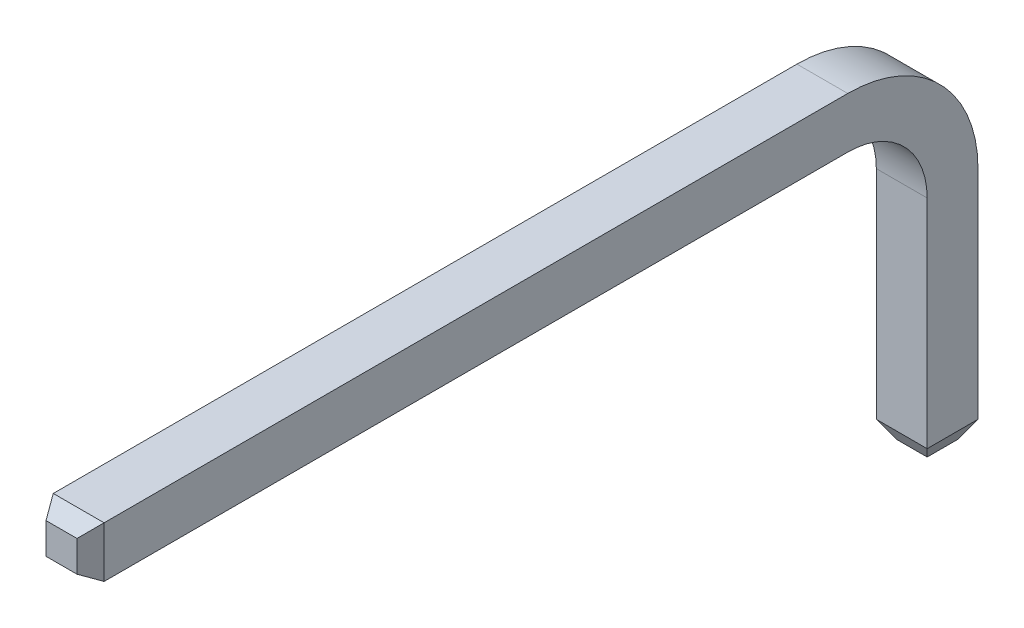
ISO-10303-21;
HEADER;
FILE_DESCRIPTION(('STEP AP214'),'2;1');
FILE_NAME('part.step','',(''),(''),'','','');
FILE_SCHEMA(('AUTOMOTIVE_DESIGN { 1 0 10303 214 1 1 1 1 }'));
ENDSEC;
DATA;
#1=APPLICATION_CONTEXT('core data for automotive mechanical design processes');
#2=APPLICATION_PROTOCOL_DEFINITION('international standard','automotive_design',2000,#1);
#3=PRODUCT_CONTEXT('',#1,'mechanical');
#4=PRODUCT('Part','Part','',(#3));
#5=PRODUCT_RELATED_PRODUCT_CATEGORY('part','',(#4));
#6=PRODUCT_DEFINITION_FORMATION('','',#4);
#7=PRODUCT_DEFINITION_CONTEXT('part definition',#1,'design');
#8=PRODUCT_DEFINITION('design','',#6,#7);
#9=PRODUCT_DEFINITION_SHAPE('','',#8);
#10=(LENGTH_UNIT() NAMED_UNIT(*) SI_UNIT(.MILLI.,.METRE.));
#11=(NAMED_UNIT(*) PLANE_ANGLE_UNIT() SI_UNIT($,.RADIAN.));
#12=(NAMED_UNIT(*) SI_UNIT($,.STERADIAN.) SOLID_ANGLE_UNIT());
#13=UNCERTAINTY_MEASURE_WITH_UNIT(LENGTH_MEASURE(1.E-05),#10,'distance_accuracy_value','');
#14=(GEOMETRIC_REPRESENTATION_CONTEXT(3) GLOBAL_UNCERTAINTY_ASSIGNED_CONTEXT((#13)) GLOBAL_UNIT_ASSIGNED_CONTEXT((#10,
#11,#12)) REPRESENTATION_CONTEXT('',''));
#15=CARTESIAN_POINT('',(0.,0.,0.));
#16=DIRECTION('',(0.,0.,1.));
#17=DIRECTION('',(1.,0.,0.));
#18=AXIS2_PLACEMENT_3D('',#15,#16,#17);
#19=CARTESIAN_POINT('',(0.195,-4.27,-1.78));
#20=DIRECTION('',(-0.866025403784329,0.50000000000019,0.));
#21=DIRECTION('',(-0.50000000000019,-0.866025403784329,0.));
#22=AXIS2_PLACEMENT_3D('',#19,#20,#21);
#23=PLANE('',#22);
#24=DIRECTION('',(0.,0.,-1.));
#25=VECTOR('',#24,1.);
#26=CARTESIAN_POINT('',(0.32,-4.053493649054,9.44));
#27=LINE('',#26,#25);
#28=CARTESIAN_POINT('',(0.32,-4.053493649054,-1.14));
#29=VERTEX_POINT('',#28);
#30=CARTESIAN_POINT('',(0.32,-4.053493649054,-1.78));
#31=VERTEX_POINT('',#30);
#32=EDGE_CURVE('E109',#29,#31,#27,.T.);
#33=ORIENTED_EDGE('',*,*,#32,.F.);
#34=DIRECTION('',(-0.447213595500096,-0.774596669241325,-0.447213595500094));
#35=VECTOR('',#34,1.);
#36=CARTESIAN_POINT('',(0.32,-4.053493649054,-1.14));
#37=LINE('',#36,#35);
#38=CARTESIAN_POINT('',(0.195,-4.27,-1.265));
#39=VERTEX_POINT('',#38);
#40=EDGE_CURVE('E191',#29,#39,#37,.T.);
#41=ORIENTED_EDGE('',*,*,#40,.T.);
#42=DIRECTION('',(0.,0.,-1.));
#43=VECTOR('',#42,1.);
#44=CARTESIAN_POINT('',(0.195,-4.27,-1.46));
#45=LINE('',#44,#43);
#46=CARTESIAN_POINT('',(0.195,-4.27,-1.655));
#47=VERTEX_POINT('',#46);
#48=EDGE_CURVE('E208',#47,#39,#45,.F.);
#49=ORIENTED_EDGE('',*,*,#48,.F.);
#50=DIRECTION('',(0.447213595500096,0.774596669241325,-0.447213595500094));
#51=VECTOR('',#50,1.);
#52=CARTESIAN_POINT('',(0.195,-4.27,-1.655));
#53=LINE('',#52,#51);
#54=EDGE_CURVE('E200',#47,#31,#53,.T.);
#55=ORIENTED_EDGE('',*,*,#54,.T.);
#56=EDGE_LOOP('',(#33,#41,#49,#55));
#57=FACE_BOUND('',#56,.T.);
#58=ADVANCED_FACE('F16',(#57),#23,.F.);
#59=CARTESIAN_POINT('',(0.195,0.32,9.44));
#60=DIRECTION('',(0.866025403784329,0.,0.50000000000019));
#61=DIRECTION('',(0.50000000000019,0.,-0.866025403784329));
#62=AXIS2_PLACEMENT_3D('',#59,#60,#61);
#63=PLANE('',#62);
#64=DIRECTION('',(0.447213595500092,0.447213595500094,-0.774596669241328));
#65=VECTOR('',#64,1.);
#66=CARTESIAN_POINT('',(0.195,0.195,9.44));
#67=LINE('',#66,#65);
#68=CARTESIAN_POINT('',(0.195,0.195,9.44));
#69=VERTEX_POINT('',#68);
#70=CARTESIAN_POINT('',(0.32,0.32,9.223493649054));
#71=VERTEX_POINT('',#70);
#72=EDGE_CURVE('E169',#69,#71,#67,.T.);
#73=ORIENTED_EDGE('',*,*,#72,.F.);
#74=DIRECTION('',(0.,1.,0.));
#75=VECTOR('',#74,1.);
#76=CARTESIAN_POINT('',(0.195,0.,9.44));
#77=LINE('',#76,#75);
#78=CARTESIAN_POINT('',(0.195,-0.195,9.44));
#79=VERTEX_POINT('',#78);
#80=EDGE_CURVE('E165',#69,#79,#77,.F.);
#81=ORIENTED_EDGE('',*,*,#80,.T.);
#82=DIRECTION('',(-0.447213595500092,0.447213595500094,0.774596669241328));
#83=VECTOR('',#82,1.);
#84=CARTESIAN_POINT('',(0.32,-0.320000000000001,9.223493649054));
#85=LINE('',#84,#83);
#86=CARTESIAN_POINT('',(0.32,-0.32,9.223493649054));
#87=VERTEX_POINT('',#86);
#88=EDGE_CURVE('E160',#87,#79,#85,.T.);
#89=ORIENTED_EDGE('',*,*,#88,.F.);
#90=DIRECTION('',(0.,1.,0.));
#91=VECTOR('',#90,1.);
#92=CARTESIAN_POINT('',(0.32,0.32,9.223493649054));
#93=LINE('',#92,#91);
#94=EDGE_CURVE('E178',#71,#87,#93,.F.);
#95=ORIENTED_EDGE('',*,*,#94,.F.);
#96=EDGE_LOOP('',(#73,#81,#89,#95));
#97=FACE_BOUND('',#96,.T.);
#98=ADVANCED_FACE('F308',(#97),#63,.T.);
#99=CARTESIAN_POINT('',(0.,-4.27,-1.46));
#100=DIRECTION('',(0.,-1.,0.));
#101=DIRECTION('',(0.,0.,-1.));
#102=AXIS2_PLACEMENT_3D('',#99,#100,#101);
#103=PLANE('',#102);
#104=ORIENTED_EDGE('',*,*,#48,.T.);
#105=DIRECTION('',(1.,0.,0.));
#106=VECTOR('',#105,1.);
#107=CARTESIAN_POINT('',(0.32,-4.27,-1.265));
#108=LINE('',#107,#106);
#109=CARTESIAN_POINT('',(-0.195,-4.27,-1.265));
#110=VERTEX_POINT('',#109);
#111=EDGE_CURVE('E196',#39,#110,#108,.F.);
#112=ORIENTED_EDGE('',*,*,#111,.T.);
#113=DIRECTION('',(0.,0.,1.));
#114=VECTOR('',#113,1.);
#115=CARTESIAN_POINT('',(-0.195,-4.27,-1.14));
#116=LINE('',#115,#114);
#117=CARTESIAN_POINT('',(-0.195,-4.27,-1.655));
#118=VERTEX_POINT('',#117);
#119=EDGE_CURVE('E128',#110,#118,#116,.F.);
#120=ORIENTED_EDGE('',*,*,#119,.T.);
#121=DIRECTION('',(1.,0.,0.));
#122=VECTOR('',#121,1.);
#123=CARTESIAN_POINT('',(-0.32,-4.27,-1.655));
#124=LINE('',#123,#122);
#125=EDGE_CURVE('E205',#118,#47,#124,.T.);
#126=ORIENTED_EDGE('',*,*,#125,.T.);
#127=EDGE_LOOP('',(#104,#112,#120,#126));
#128=FACE_BOUND('',#127,.T.);
#129=ADVANCED_FACE('F306',(#128),#103,.T.);
#130=CARTESIAN_POINT('',(-0.32,-4.27,-1.655));
#131=DIRECTION('',(0.,0.50000000000019,0.866025403784329));
#132=DIRECTION('',(0.,-0.866025403784329,0.50000000000019));
#133=AXIS2_PLACEMENT_3D('',#130,#131,#132);
#134=PLANE('',#133);
#135=DIRECTION('',(-1.,0.,0.));
#136=VECTOR('',#135,1.);
#137=CARTESIAN_POINT('',(-0.32,-4.053493649054,-1.78));
#138=LINE('',#137,#136);
#139=CARTESIAN_POINT('',(-0.32,-4.053493649054,-1.78));
#140=VERTEX_POINT('',#139);
#141=EDGE_CURVE('E114',#31,#140,#138,.T.);
#142=ORIENTED_EDGE('',*,*,#141,.F.);
#143=ORIENTED_EDGE('',*,*,#54,.F.);
#144=ORIENTED_EDGE('',*,*,#125,.F.);
#145=DIRECTION('',(-0.447213595500093,0.774596669241325,-0.447213595500096));
#146=VECTOR('',#145,1.);
#147=CARTESIAN_POINT('',(-0.195,-4.27,-1.655));
#148=LINE('',#147,#146);
#149=EDGE_CURVE('E130',#118,#140,#148,.T.);
#150=ORIENTED_EDGE('',*,*,#149,.T.);
#151=EDGE_LOOP('',(#142,#143,#144,#150));
#152=FACE_BOUND('',#151,.T.);
#153=ADVANCED_FACE('F264',(#152),#134,.F.);
#154=CARTESIAN_POINT('',(0.32,-4.27,-1.265));
#155=DIRECTION('',(0.,0.50000000000019,-0.866025403784329));
#156=DIRECTION('',(0.,0.866025403784329,0.50000000000019));
#157=AXIS2_PLACEMENT_3D('',#154,#155,#156);
#158=PLANE('',#157);
#159=DIRECTION('',(1.,0.,0.));
#160=VECTOR('',#159,1.);
#161=CARTESIAN_POINT('',(0.32,-4.053493649054,-1.14));
#162=LINE('',#161,#160);
#163=CARTESIAN_POINT('',(-0.32,-4.053493649054,-1.14));
#164=VERTEX_POINT('',#163);
#165=EDGE_CURVE('E187',#164,#29,#162,.T.);
#166=ORIENTED_EDGE('',*,*,#165,.F.);
#167=DIRECTION('',(0.447213595500094,-0.774596669241326,-0.447213595500096));
#168=VECTOR('',#167,1.);
#169=CARTESIAN_POINT('',(-0.319999999999999,-4.053493649054,-1.14));
#170=LINE('',#169,#168);
#171=EDGE_CURVE('E250',#164,#110,#170,.T.);
#172=ORIENTED_EDGE('',*,*,#171,.T.);
#173=ORIENTED_EDGE('',*,*,#111,.F.);
#174=ORIENTED_EDGE('',*,*,#40,.F.);
#175=EDGE_LOOP('',(#166,#172,#173,#174));
#176=FACE_BOUND('',#175,.T.);
#177=ADVANCED_FACE('F302',(#176),#158,.F.);
#178=CARTESIAN_POINT('',(0.32,0.32,9.44));
#179=DIRECTION('',(1.,0.,0.));
#180=DIRECTION('',(0.,0.,-1.));
#181=AXIS2_PLACEMENT_3D('',#178,#179,#180);
#182=PLANE('',#181);
#183=DIRECTION('',(0.,0.,1.));
#184=VECTOR('',#183,1.);
#185=CARTESIAN_POINT('',(0.32,0.32,9.44));
#186=LINE('',#185,#184);
#187=CARTESIAN_POINT('',(0.32,0.32,-0.14));
#188=VERTEX_POINT('',#187);
#189=EDGE_CURVE('E142',#71,#188,#186,.F.);
#190=ORIENTED_EDGE('',*,*,#189,.F.);
#191=ORIENTED_EDGE('',*,*,#94,.T.);
#192=DIRECTION('',(0.,0.,-1.));
#193=VECTOR('',#192,1.);
#194=CARTESIAN_POINT('',(0.32,-0.32,9.44));
#195=LINE('',#194,#193);
#196=CARTESIAN_POINT('',(0.32,-0.32,-0.14));
#197=VERTEX_POINT('',#196);
#198=EDGE_CURVE('E172',#197,#87,#195,.F.);
#199=ORIENTED_EDGE('',*,*,#198,.F.);
#200=CARTESIAN_POINT('',(0.32,-1.32,-0.14));
#201=DIRECTION('',(-1.,0.,0.));
#202=DIRECTION('',(0.,0.,1.));
#203=AXIS2_PLACEMENT_3D('',#200,#201,#202);
#204=CIRCLE('',#203,1.);
#205=CARTESIAN_POINT('',(0.32,-1.32,-1.14));
#206=VERTEX_POINT('',#205);
#207=EDGE_CURVE('E186',#197,#206,#204,.T.);
#208=ORIENTED_EDGE('',*,*,#207,.T.);
#209=DIRECTION('',(0.,1.,0.));
#210=VECTOR('',#209,1.);
#211=CARTESIAN_POINT('',(0.32,-1.32,-1.14));
#212=LINE('',#211,#210);
#213=EDGE_CURVE('E183',#29,#206,#212,.T.);
#214=ORIENTED_EDGE('',*,*,#213,.F.);
#215=ORIENTED_EDGE('',*,*,#32,.T.);
#216=DIRECTION('',(0.,1.,0.));
#217=VECTOR('',#216,1.);
#218=CARTESIAN_POINT('',(0.32,-1.32,-1.78));
#219=LINE('',#218,#217);
#220=CARTESIAN_POINT('',(0.32,-1.32,-1.78));
#221=VERTEX_POINT('',#220);
#222=EDGE_CURVE('E106',#221,#31,#219,.F.);
#223=ORIENTED_EDGE('',*,*,#222,.F.);
#224=CARTESIAN_POINT('',(0.32,-1.32,-0.14));
#225=DIRECTION('',(-1.,0.,0.));
#226=DIRECTION('',(0.,0.,1.));
#227=AXIS2_PLACEMENT_3D('',#224,#225,#226);
#228=CIRCLE('',#227,1.64);
#229=EDGE_CURVE('E19',#188,#221,#228,.T.);
#230=ORIENTED_EDGE('',*,*,#229,.F.);
#231=EDGE_LOOP('',(#190,#191,#199,#208,#214,#215,#223,#230));
#232=FACE_BOUND('',#231,.T.);
#233=ADVANCED_FACE('F107',(#232),#182,.T.);
#234=CARTESIAN_POINT('',(-0.32,0.195,9.44));
#235=DIRECTION('',(0.,0.866025403784329,0.50000000000019));
#236=DIRECTION('',(0.,-0.50000000000019,0.866025403784329));
#237=AXIS2_PLACEMENT_3D('',#234,#235,#236);
#238=PLANE('',#237);
#239=DIRECTION('',(-0.447213595500094,0.447213595500092,-0.774596669241328));
#240=VECTOR('',#239,1.);
#241=CARTESIAN_POINT('',(-0.195,0.195,9.44));
#242=LINE('',#241,#240);
#243=CARTESIAN_POINT('',(-0.195,0.195,9.44));
#244=VERTEX_POINT('',#243);
#245=CARTESIAN_POINT('',(-0.32,0.32,9.223493649054));
#246=VERTEX_POINT('',#245);
#247=EDGE_CURVE('E145',#244,#246,#242,.T.);
#248=ORIENTED_EDGE('',*,*,#247,.F.);
#249=DIRECTION('',(-1.,0.,0.));
#250=VECTOR('',#249,1.);
#251=CARTESIAN_POINT('',(0.,0.195,9.44));
#252=LINE('',#251,#250);
#253=EDGE_CURVE('E159',#244,#69,#252,.F.);
#254=ORIENTED_EDGE('',*,*,#253,.T.);
#255=ORIENTED_EDGE('',*,*,#72,.T.);
#256=DIRECTION('',(1.,0.,0.));
#257=VECTOR('',#256,1.);
#258=CARTESIAN_POINT('',(-0.32,0.32,9.223493649054));
#259=LINE('',#258,#257);
#260=EDGE_CURVE('E123',#246,#71,#259,.T.);
#261=ORIENTED_EDGE('',*,*,#260,.F.);
#262=EDGE_LOOP('',(#248,#254,#255,#261));
#263=FACE_BOUND('',#262,.T.);
#264=ADVANCED_FACE('F350',(#263),#238,.T.);
#265=CARTESIAN_POINT('',(0.32,-0.195,9.44));
#266=DIRECTION('',(0.,-0.866025403784329,0.50000000000019));
#267=DIRECTION('',(0.,-0.50000000000019,-0.866025403784329));
#268=AXIS2_PLACEMENT_3D('',#265,#266,#267);
#269=PLANE('',#268);
#270=ORIENTED_EDGE('',*,*,#88,.T.);
#271=DIRECTION('',(-1.,0.,0.));
#272=VECTOR('',#271,1.);
#273=CARTESIAN_POINT('',(0.,-0.195,9.44));
#274=LINE('',#273,#272);
#275=CARTESIAN_POINT('',(-0.195,-0.195,9.44));
#276=VERTEX_POINT('',#275);
#277=EDGE_CURVE('E157',#79,#276,#274,.T.);
#278=ORIENTED_EDGE('',*,*,#277,.T.);
#279=DIRECTION('',(0.447213595500094,0.447213595500092,0.774596669241328));
#280=VECTOR('',#279,1.);
#281=CARTESIAN_POINT('',(-0.320000000000001,-0.32,9.223493649054));
#282=LINE('',#281,#280);
#283=CARTESIAN_POINT('',(-0.32,-0.32,9.223493649054));
#284=VERTEX_POINT('',#283);
#285=EDGE_CURVE('E34',#284,#276,#282,.T.);
#286=ORIENTED_EDGE('',*,*,#285,.F.);
#287=DIRECTION('',(1.,0.,0.));
#288=VECTOR('',#287,1.);
#289=CARTESIAN_POINT('',(0.32,-0.32,9.223493649054));
#290=LINE('',#289,#288);
#291=EDGE_CURVE('E148',#87,#284,#290,.F.);
#292=ORIENTED_EDGE('',*,*,#291,.F.);
#293=EDGE_LOOP('',(#270,#278,#286,#292));
#294=FACE_BOUND('',#293,.T.);
#295=ADVANCED_FACE('F346',(#294),#269,.T.);
#296=CARTESIAN_POINT('',(0.,0.,9.44));
#297=DIRECTION('',(0.,0.,-1.));
#298=DIRECTION('',(-1.,0.,0.));
#299=AXIS2_PLACEMENT_3D('',#296,#297,#298);
#300=PLANE('',#299);
#301=ORIENTED_EDGE('',*,*,#253,.F.);
#302=DIRECTION('',(0.,1.,0.));
#303=VECTOR('',#302,1.);
#304=CARTESIAN_POINT('',(-0.195,-0.32,9.44));
#305=LINE('',#304,#303);
#306=EDGE_CURVE('E151',#276,#244,#305,.T.);
#307=ORIENTED_EDGE('',*,*,#306,.F.);
#308=ORIENTED_EDGE('',*,*,#277,.F.);
#309=ORIENTED_EDGE('',*,*,#80,.F.);
#310=EDGE_LOOP('',(#301,#307,#308,#309));
#311=FACE_BOUND('',#310,.T.);
#312=ADVANCED_FACE('F342',(#311),#300,.F.);
#313=CARTESIAN_POINT('',(-0.32,0.32,9.44));
#314=DIRECTION('',(0.,1.,0.));
#315=DIRECTION('',(0.,0.,1.));
#316=AXIS2_PLACEMENT_3D('',#313,#314,#315);
#317=PLANE('',#316);
#318=DIRECTION('',(0.,0.,1.));
#319=VECTOR('',#318,1.);
#320=CARTESIAN_POINT('',(-0.32,0.32,9.44));
#321=LINE('',#320,#319);
#322=CARTESIAN_POINT('',(-0.32,0.32,-0.14));
#323=VERTEX_POINT('',#322);
#324=EDGE_CURVE('E154',#246,#323,#321,.F.);
#325=ORIENTED_EDGE('',*,*,#324,.F.);
#326=ORIENTED_EDGE('',*,*,#260,.T.);
#327=ORIENTED_EDGE('',*,*,#189,.T.);
#328=DIRECTION('',(-1.,0.,0.));
#329=VECTOR('',#328,1.);
#330=CARTESIAN_POINT('',(1.,0.32,-0.14));
#331=LINE('',#330,#329);
#332=EDGE_CURVE('E115',#323,#188,#331,.F.);
#333=ORIENTED_EDGE('',*,*,#332,.F.);
#334=EDGE_LOOP('',(#325,#326,#327,#333));
#335=FACE_BOUND('',#334,.T.);
#336=ADVANCED_FACE('F339',(#335),#317,.T.);
#337=CARTESIAN_POINT('',(1.,-1.32,-0.14));
#338=DIRECTION('',(-1.,0.,0.));
#339=DIRECTION('',(0.,0.,1.));
#340=AXIS2_PLACEMENT_3D('',#337,#338,#339);
#341=CYLINDRICAL_SURFACE('',#340,1.64);
#342=CARTESIAN_POINT('',(-0.32,-1.32,-0.14));
#343=DIRECTION('',(-1.,0.,0.));
#344=DIRECTION('',(0.,0.,1.));
#345=AXIS2_PLACEMENT_3D('',#342,#343,#344);
#346=CIRCLE('',#345,1.64);
#347=CARTESIAN_POINT('',(-0.32,-1.32,-1.78));
#348=VERTEX_POINT('',#347);
#349=EDGE_CURVE('E234',#323,#348,#346,.T.);
#350=ORIENTED_EDGE('',*,*,#349,.F.);
#351=ORIENTED_EDGE('',*,*,#332,.T.);
#352=ORIENTED_EDGE('',*,*,#229,.T.);
#353=DIRECTION('',(-1.,0.,0.));
#354=VECTOR('',#353,1.);
#355=CARTESIAN_POINT('',(-0.32,-1.32,-1.78));
#356=LINE('',#355,#354);
#357=EDGE_CURVE('E121',#348,#221,#356,.F.);
#358=ORIENTED_EDGE('',*,*,#357,.F.);
#359=EDGE_LOOP('',(#350,#351,#352,#358));
#360=FACE_BOUND('',#359,.T.);
#361=ADVANCED_FACE('F120',(#360),#341,.T.);
#362=CARTESIAN_POINT('',(-0.32,-1.32,-1.78));
#363=DIRECTION('',(0.,0.,-1.));
#364=DIRECTION('',(-1.,0.,0.));
#365=AXIS2_PLACEMENT_3D('',#362,#363,#364);
#366=PLANE('',#365);
#367=DIRECTION('',(0.,1.,0.));
#368=VECTOR('',#367,1.);
#369=CARTESIAN_POINT('',(-0.32,-0.32,-1.78));
#370=LINE('',#369,#368);
#371=EDGE_CURVE('E126',#348,#140,#370,.F.);
#372=ORIENTED_EDGE('',*,*,#371,.F.);
#373=ORIENTED_EDGE('',*,*,#357,.T.);
#374=ORIENTED_EDGE('',*,*,#222,.T.);
#375=ORIENTED_EDGE('',*,*,#141,.T.);
#376=EDGE_LOOP('',(#372,#373,#374,#375));
#377=FACE_BOUND('',#376,.T.);
#378=ADVANCED_FACE('F124',(#377),#366,.T.);
#379=CARTESIAN_POINT('',(-0.195,-4.27,-1.14));
#380=DIRECTION('',(0.866025403784329,0.50000000000019,0.));
#381=DIRECTION('',(-0.50000000000019,0.866025403784329,0.));
#382=AXIS2_PLACEMENT_3D('',#379,#380,#381);
#383=PLANE('',#382);
#384=DIRECTION('',(0.,0.,1.));
#385=VECTOR('',#384,1.);
#386=CARTESIAN_POINT('',(-0.32,-4.053493649054,9.44));
#387=LINE('',#386,#385);
#388=EDGE_CURVE('E253',#140,#164,#387,.T.);
#389=ORIENTED_EDGE('',*,*,#388,.F.);
#390=ORIENTED_EDGE('',*,*,#149,.F.);
#391=ORIENTED_EDGE('',*,*,#119,.F.);
#392=ORIENTED_EDGE('',*,*,#171,.F.);
#393=EDGE_LOOP('',(#389,#390,#391,#392));
#394=FACE_BOUND('',#393,.T.);
#395=ADVANCED_FACE('F270',(#394),#383,.F.);
#396=CARTESIAN_POINT('',(0.32,-1.32,-1.14));
#397=DIRECTION('',(0.,0.,1.));
#398=DIRECTION('',(1.,0.,0.));
#399=AXIS2_PLACEMENT_3D('',#396,#397,#398);
#400=PLANE('',#399);
#401=ORIENTED_EDGE('',*,*,#213,.T.);
#402=DIRECTION('',(-1.,0.,0.));
#403=VECTOR('',#402,1.);
#404=CARTESIAN_POINT('',(1.,-1.32,-1.14));
#405=LINE('',#404,#403);
#406=CARTESIAN_POINT('',(-0.32,-1.32,-1.14));
#407=VERTEX_POINT('',#406);
#408=EDGE_CURVE('E235',#206,#407,#405,.T.);
#409=ORIENTED_EDGE('',*,*,#408,.T.);
#410=DIRECTION('',(0.,1.,0.));
#411=VECTOR('',#410,1.);
#412=CARTESIAN_POINT('',(-0.32,-0.32,-1.14));
#413=LINE('',#412,#411);
#414=EDGE_CURVE('E233',#164,#407,#413,.T.);
#415=ORIENTED_EDGE('',*,*,#414,.F.);
#416=ORIENTED_EDGE('',*,*,#165,.T.);
#417=EDGE_LOOP('',(#401,#409,#415,#416));
#418=FACE_BOUND('',#417,.T.);
#419=ADVANCED_FACE('F299',(#418),#400,.T.);
#420=CARTESIAN_POINT('',(1.,-1.32,-0.14));
#421=DIRECTION('',(-1.,0.,0.));
#422=DIRECTION('',(0.,0.,1.));
#423=AXIS2_PLACEMENT_3D('',#420,#421,#422);
#424=CYLINDRICAL_SURFACE('',#423,1.);
#425=ORIENTED_EDGE('',*,*,#408,.F.);
#426=ORIENTED_EDGE('',*,*,#207,.F.);
#427=DIRECTION('',(1.,0.,0.));
#428=VECTOR('',#427,1.);
#429=CARTESIAN_POINT('',(0.32,-0.32,-0.14));
#430=LINE('',#429,#428);
#431=CARTESIAN_POINT('',(-0.32,-0.32,-0.14));
#432=VERTEX_POINT('',#431);
#433=EDGE_CURVE('E175',#432,#197,#430,.T.);
#434=ORIENTED_EDGE('',*,*,#433,.F.);
#435=CARTESIAN_POINT('',(-0.32,-1.32,-0.14));
#436=DIRECTION('',(-1.,0.,0.));
#437=DIRECTION('',(0.,0.,1.));
#438=AXIS2_PLACEMENT_3D('',#435,#436,#437);
#439=CIRCLE('',#438,1.);
#440=EDGE_CURVE('E230',#407,#432,#439,.F.);
#441=ORIENTED_EDGE('',*,*,#440,.F.);
#442=EDGE_LOOP('',(#425,#426,#434,#441));
#443=FACE_BOUND('',#442,.T.);
#444=ADVANCED_FACE('F327',(#443),#424,.F.);
#445=CARTESIAN_POINT('',(0.32,-0.32,9.44));
#446=DIRECTION('',(0.,-1.,0.));
#447=DIRECTION('',(0.,0.,-1.));
#448=AXIS2_PLACEMENT_3D('',#445,#446,#447);
#449=PLANE('',#448);
#450=ORIENTED_EDGE('',*,*,#198,.T.);
#451=ORIENTED_EDGE('',*,*,#291,.T.);
#452=DIRECTION('',(0.,0.,1.));
#453=VECTOR('',#452,1.);
#454=CARTESIAN_POINT('',(-0.32,-0.32,9.44));
#455=LINE('',#454,#453);
#456=EDGE_CURVE('E25',#432,#284,#455,.T.);
#457=ORIENTED_EDGE('',*,*,#456,.F.);
#458=ORIENTED_EDGE('',*,*,#433,.T.);
#459=EDGE_LOOP('',(#450,#451,#457,#458));
#460=FACE_BOUND('',#459,.T.);
#461=ADVANCED_FACE('F322',(#460),#449,.T.);
#462=CARTESIAN_POINT('',(-0.195,-0.32,9.44));
#463=DIRECTION('',(-0.866025403784329,0.,0.50000000000019));
#464=DIRECTION('',(0.50000000000019,0.,0.866025403784329));
#465=AXIS2_PLACEMENT_3D('',#462,#463,#464);
#466=PLANE('',#465);
#467=ORIENTED_EDGE('',*,*,#285,.T.);
#468=ORIENTED_EDGE('',*,*,#306,.T.);
#469=ORIENTED_EDGE('',*,*,#247,.T.);
#470=DIRECTION('',(0.,1.,0.));
#471=VECTOR('',#470,1.);
#472=CARTESIAN_POINT('',(-0.32,-0.32,9.223493649054));
#473=LINE('',#472,#471);
#474=EDGE_CURVE('E11',#284,#246,#473,.T.);
#475=ORIENTED_EDGE('',*,*,#474,.F.);
#476=EDGE_LOOP('',(#467,#468,#469,#475));
#477=FACE_BOUND('',#476,.T.);
#478=ADVANCED_FACE('F292',(#477),#466,.T.);
#479=CARTESIAN_POINT('',(-0.32,-0.32,9.44));
#480=DIRECTION('',(-1.,0.,0.));
#481=DIRECTION('',(0.,0.,1.));
#482=AXIS2_PLACEMENT_3D('',#479,#480,#481);
#483=PLANE('',#482);
#484=ORIENTED_EDGE('',*,*,#456,.T.);
#485=ORIENTED_EDGE('',*,*,#474,.T.);
#486=ORIENTED_EDGE('',*,*,#324,.T.);
#487=ORIENTED_EDGE('',*,*,#349,.T.);
#488=ORIENTED_EDGE('',*,*,#371,.T.);
#489=ORIENTED_EDGE('',*,*,#388,.T.);
#490=ORIENTED_EDGE('',*,*,#414,.T.);
#491=ORIENTED_EDGE('',*,*,#440,.T.);
#492=EDGE_LOOP('',(#484,#485,#486,#487,#488,#489,#490,#491));
#493=FACE_BOUND('',#492,.T.);
#494=ADVANCED_FACE('F274',(#493),#483,.T.);
#495=CLOSED_SHELL('',(#58,#98,#129,#153,#177,#233,#264,#295,#312,#336,#361,#378,#395,#419,#444,
#461,#478,#494));
#496=MANIFOLD_SOLID_BREP('B1',#495);
#497=ADVANCED_BREP_SHAPE_REPRESENTATION('',(#18,#496),#14);
#498=SHAPE_DEFINITION_REPRESENTATION(#9,#497);
ENDSEC;
END-ISO-10303-21;
